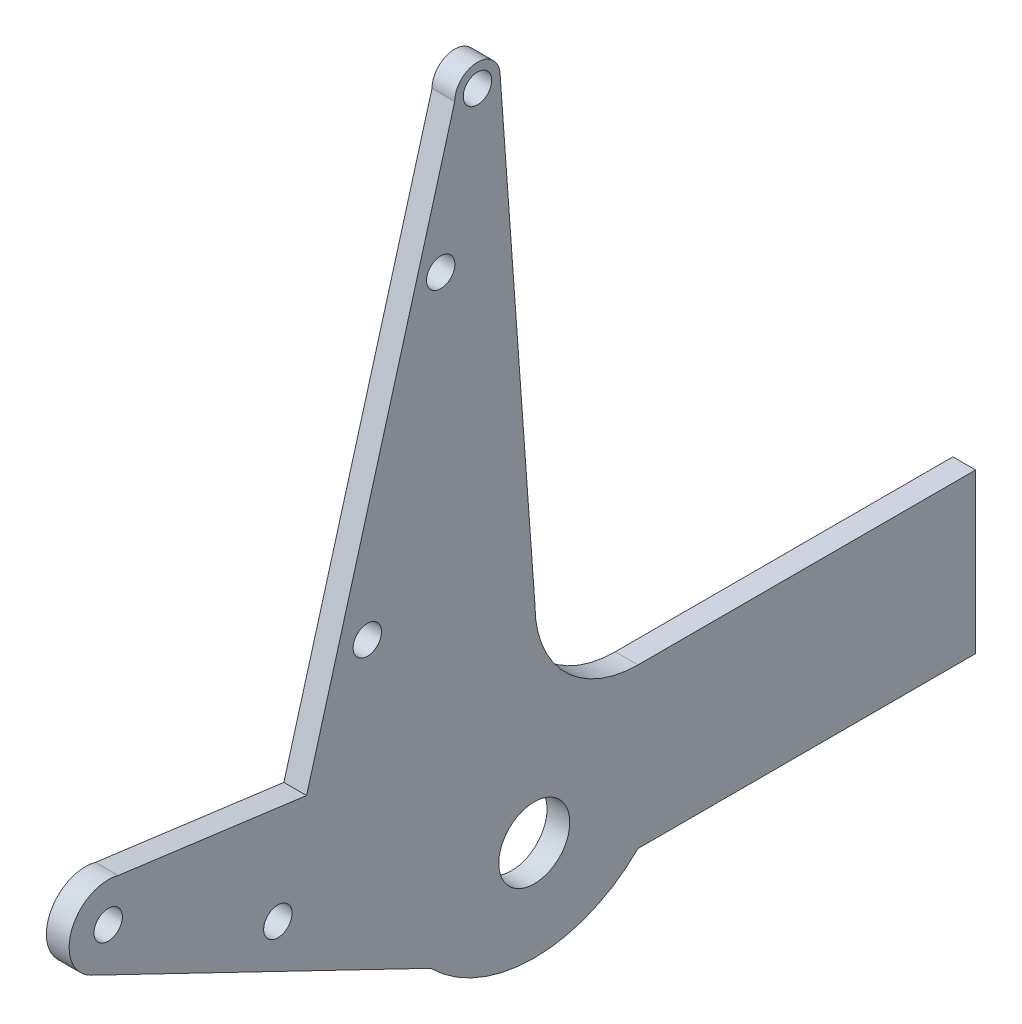
ISO-10303-21;
HEADER;
FILE_DESCRIPTION(('STEP AP214'),'2;1');
FILE_NAME('part.step','',(''),(''),'','','');
FILE_SCHEMA(('AUTOMOTIVE_DESIGN { 1 0 10303 214 1 1 1 1 }'));
ENDSEC;
DATA;
#1=APPLICATION_CONTEXT('core data for automotive mechanical design processes');
#2=APPLICATION_PROTOCOL_DEFINITION('international standard','automotive_design',2000,#1);
#3=PRODUCT_CONTEXT('',#1,'mechanical');
#4=PRODUCT('Part','Part','',(#3));
#5=PRODUCT_RELATED_PRODUCT_CATEGORY('part','',(#4));
#6=PRODUCT_DEFINITION_FORMATION('','',#4);
#7=PRODUCT_DEFINITION_CONTEXT('part definition',#1,'design');
#8=PRODUCT_DEFINITION('design','',#6,#7);
#9=PRODUCT_DEFINITION_SHAPE('','',#8);
#10=(LENGTH_UNIT() NAMED_UNIT(*) SI_UNIT(.MILLI.,.METRE.));
#11=(NAMED_UNIT(*) PLANE_ANGLE_UNIT() SI_UNIT($,.RADIAN.));
#12=(NAMED_UNIT(*) SI_UNIT($,.STERADIAN.) SOLID_ANGLE_UNIT());
#13=UNCERTAINTY_MEASURE_WITH_UNIT(LENGTH_MEASURE(1.E-05),#10,'distance_accuracy_value','');
#14=(GEOMETRIC_REPRESENTATION_CONTEXT(3) GLOBAL_UNCERTAINTY_ASSIGNED_CONTEXT((#13)) GLOBAL_UNIT_ASSIGNED_CONTEXT((#10,
#11,#12)) REPRESENTATION_CONTEXT('',''));
#15=CARTESIAN_POINT('',(0.,0.,0.));
#16=DIRECTION('',(0.,0.,1.));
#17=DIRECTION('',(1.,0.,0.));
#18=AXIS2_PLACEMENT_3D('',#15,#16,#17);
#19=CARTESIAN_POINT('',(4.,120.,85.75));
#20=DIRECTION('',(-1.,0.,0.));
#21=DIRECTION('',(0.,0.,1.));
#22=AXIS2_PLACEMENT_3D('',#19,#20,#21);
#23=CYLINDRICAL_SURFACE('',#22,2.5);
#24=CARTESIAN_POINT('',(4.,120.,85.75));
#25=DIRECTION('',(1.,0.,0.));
#26=DIRECTION('',(0.,0.,-1.));
#27=AXIS2_PLACEMENT_3D('',#24,#25,#26);
#28=CIRCLE('',#27,2.5);
#29=CARTESIAN_POINT('',(4.,120.,83.25));
#30=VERTEX_POINT('',#29);
#31=EDGE_CURVE('E242',#30,#30,#28,.T.);
#32=ORIENTED_EDGE('',*,*,#31,.T.);
#33=EDGE_LOOP('',(#32));
#34=FACE_BOUND('',#33,.T.);
#35=CARTESIAN_POINT('',(0.,120.,85.75));
#36=DIRECTION('',(1.,0.,0.));
#37=DIRECTION('',(0.,0.,-1.));
#38=AXIS2_PLACEMENT_3D('',#35,#36,#37);
#39=CIRCLE('',#38,2.5);
#40=CARTESIAN_POINT('',(0.,120.,83.25));
#41=VERTEX_POINT('',#40);
#42=EDGE_CURVE('E279',#41,#41,#39,.T.);
#43=ORIENTED_EDGE('',*,*,#42,.F.);
#44=EDGE_LOOP('',(#43));
#45=FACE_BOUND('',#44,.T.);
#46=ADVANCED_FACE('F112',(#34,#45),#23,.F.);
#47=CARTESIAN_POINT('',(4.,95.2087246019251,92.2130097639669));
#48=DIRECTION('',(-1.,0.,0.));
#49=DIRECTION('',(0.,0.,1.));
#50=AXIS2_PLACEMENT_3D('',#47,#48,#49);
#51=CYLINDRICAL_SURFACE('',#50,2.50000000000001);
#52=CARTESIAN_POINT('',(4.,95.2087246019251,92.2130097639669));
#53=DIRECTION('',(1.,0.,0.));
#54=DIRECTION('',(0.,0.,-1.));
#55=AXIS2_PLACEMENT_3D('',#52,#53,#54);
#56=CIRCLE('',#55,2.50000000000001);
#57=CARTESIAN_POINT('',(4.,95.2087246019251,89.7130097639669));
#58=VERTEX_POINT('',#57);
#59=EDGE_CURVE('E239',#58,#58,#56,.T.);
#60=ORIENTED_EDGE('',*,*,#59,.T.);
#61=EDGE_LOOP('',(#60));
#62=FACE_BOUND('',#61,.T.);
#63=CARTESIAN_POINT('',(0.,95.2087246019251,92.2130097639669));
#64=DIRECTION('',(1.,0.,0.));
#65=DIRECTION('',(0.,0.,-1.));
#66=AXIS2_PLACEMENT_3D('',#63,#64,#65);
#67=CIRCLE('',#66,2.50000000000001);
#68=CARTESIAN_POINT('',(0.,95.2087246019251,89.7130097639669));
#69=VERTEX_POINT('',#68);
#70=EDGE_CURVE('E276',#69,#69,#67,.T.);
#71=ORIENTED_EDGE('',*,*,#70,.F.);
#72=EDGE_LOOP('',(#71));
#73=FACE_BOUND('',#72,.T.);
#74=ADVANCED_FACE('F350',(#62,#73),#51,.F.);
#75=CARTESIAN_POINT('',(4.,45.6356022797336,105.136571317542));
#76=DIRECTION('',(-1.,0.,0.));
#77=DIRECTION('',(0.,0.,1.));
#78=AXIS2_PLACEMENT_3D('',#75,#76,#77);
#79=CYLINDRICAL_SURFACE('',#78,2.50000000000001);
#80=CARTESIAN_POINT('',(4.,45.6356022797336,105.136571317542));
#81=DIRECTION('',(1.,0.,0.));
#82=DIRECTION('',(0.,0.,-1.));
#83=AXIS2_PLACEMENT_3D('',#80,#81,#82);
#84=CIRCLE('',#83,2.50000000000001);
#85=CARTESIAN_POINT('',(4.,45.6356022797336,102.636571317542));
#86=VERTEX_POINT('',#85);
#87=EDGE_CURVE('E236',#86,#86,#84,.T.);
#88=ORIENTED_EDGE('',*,*,#87,.T.);
#89=EDGE_LOOP('',(#88));
#90=FACE_BOUND('',#89,.T.);
#91=CARTESIAN_POINT('',(0.,45.6356022797336,105.136571317542));
#92=DIRECTION('',(1.,0.,0.));
#93=DIRECTION('',(0.,0.,-1.));
#94=AXIS2_PLACEMENT_3D('',#91,#92,#93);
#95=CIRCLE('',#94,2.50000000000001);
#96=CARTESIAN_POINT('',(0.,45.6356022797336,102.636571317542));
#97=VERTEX_POINT('',#96);
#98=EDGE_CURVE('E273',#97,#97,#95,.T.);
#99=ORIENTED_EDGE('',*,*,#98,.F.);
#100=EDGE_LOOP('',(#99));
#101=FACE_BOUND('',#100,.T.);
#102=ADVANCED_FACE('F356',(#90,#101),#79,.F.);
#103=CARTESIAN_POINT('',(4.,10.6007738750233,120.879671398664));
#104=DIRECTION('',(-1.,0.,0.));
#105=DIRECTION('',(0.,0.,1.));
#106=AXIS2_PLACEMENT_3D('',#103,#104,#105);
#107=CYLINDRICAL_SURFACE('',#106,2.5);
#108=CARTESIAN_POINT('',(4.,10.6007738750233,120.879671398664));
#109=DIRECTION('',(1.,0.,0.));
#110=DIRECTION('',(0.,0.,-1.));
#111=AXIS2_PLACEMENT_3D('',#108,#109,#110);
#112=CIRCLE('',#111,2.5);
#113=CARTESIAN_POINT('',(4.,10.6007738750233,118.379671398664));
#114=VERTEX_POINT('',#113);
#115=EDGE_CURVE('E233',#114,#114,#112,.T.);
#116=ORIENTED_EDGE('',*,*,#115,.T.);
#117=EDGE_LOOP('',(#116));
#118=FACE_BOUND('',#117,.T.);
#119=CARTESIAN_POINT('',(0.,10.6007738750233,120.879671398664));
#120=DIRECTION('',(1.,0.,0.));
#121=DIRECTION('',(0.,0.,-1.));
#122=AXIS2_PLACEMENT_3D('',#119,#120,#121);
#123=CIRCLE('',#122,2.5);
#124=CARTESIAN_POINT('',(0.,10.6007738750233,118.379671398664));
#125=VERTEX_POINT('',#124);
#126=EDGE_CURVE('E270',#125,#125,#123,.T.);
#127=ORIENTED_EDGE('',*,*,#126,.F.);
#128=EDGE_LOOP('',(#127));
#129=FACE_BOUND('',#128,.T.);
#130=ADVANCED_FACE('F365',(#118,#129),#107,.F.);
#131=CARTESIAN_POINT('',(4.,120.,85.75));
#132=DIRECTION('',(-1.,0.,0.));
#133=DIRECTION('',(0.,0.,1.));
#134=AXIS2_PLACEMENT_3D('',#131,#132,#133);
#135=CYLINDRICAL_SURFACE('',#134,4.00000000000001);
#136=CARTESIAN_POINT('',(0.,120.,85.75));
#137=DIRECTION('',(1.,0.,0.));
#138=DIRECTION('',(0.,0.,-1.));
#139=AXIS2_PLACEMENT_3D('',#136,#137,#138);
#140=CIRCLE('',#139,4.00000000000001);
#141=CARTESIAN_POINT('',(0.,120.,81.75));
#142=VERTEX_POINT('',#141);
#143=CARTESIAN_POINT('',(0.,120.,89.75));
#144=VERTEX_POINT('',#143);
#145=EDGE_CURVE('E253',#142,#144,#140,.T.);
#146=ORIENTED_EDGE('',*,*,#145,.T.);
#147=DIRECTION('',(-1.,0.,0.));
#148=VECTOR('',#147,1.);
#149=CARTESIAN_POINT('',(4.,120.,89.75));
#150=LINE('',#149,#148);
#151=CARTESIAN_POINT('',(4.,120.,89.75));
#152=VERTEX_POINT('',#151);
#153=EDGE_CURVE('E122',#152,#144,#150,.T.);
#154=ORIENTED_EDGE('',*,*,#153,.F.);
#155=CARTESIAN_POINT('',(4.,120.,85.75));
#156=DIRECTION('',(1.,0.,0.));
#157=DIRECTION('',(0.,0.,-1.));
#158=AXIS2_PLACEMENT_3D('',#155,#156,#157);
#159=CIRCLE('',#158,4.00000000000001);
#160=CARTESIAN_POINT('',(4.,120.,81.75));
#161=VERTEX_POINT('',#160);
#162=EDGE_CURVE('E178',#161,#152,#159,.T.);
#163=ORIENTED_EDGE('',*,*,#162,.F.);
#164=DIRECTION('',(-1.,0.,0.));
#165=VECTOR('',#164,1.);
#166=CARTESIAN_POINT('',(4.,120.,81.75));
#167=LINE('',#166,#165);
#168=EDGE_CURVE('E12',#161,#142,#167,.T.);
#169=ORIENTED_EDGE('',*,*,#168,.T.);
#170=EDGE_LOOP('',(#146,#154,#163,#169));
#171=FACE_BOUND('',#170,.T.);
#172=ADVANCED_FACE('F368',(#171),#135,.T.);
#173=CARTESIAN_POINT('',(4.,32.1711600489639,114.440230481754));
#174=DIRECTION('',(0.,0.270627436163678,0.962684159418588));
#175=DIRECTION('',(0.,-0.962684159418588,0.270627436163678));
#176=AXIS2_PLACEMENT_3D('',#173,#174,#175);
#177=PLANE('',#176);
#178=DIRECTION('',(0.,0.962684159418588,-0.270627436163678));
#179=VECTOR('',#178,1.);
#180=CARTESIAN_POINT('',(0.,32.1711600489639,114.440230481754));
#181=LINE('',#180,#179);
#182=CARTESIAN_POINT('',(0.,27.2536423524357,115.822631130483));
#183=VERTEX_POINT('',#182);
#184=EDGE_CURVE('E256',#183,#144,#181,.T.);
#185=ORIENTED_EDGE('',*,*,#184,.F.);
#186=DIRECTION('',(-1.,0.,0.));
#187=VECTOR('',#186,1.);
#188=CARTESIAN_POINT('',(4.,27.2536423524357,115.822631130483));
#189=LINE('',#188,#187);
#190=CARTESIAN_POINT('',(4.,27.2536423524357,115.822631130483));
#191=VERTEX_POINT('',#190);
#192=EDGE_CURVE('E290',#191,#183,#189,.T.);
#193=ORIENTED_EDGE('',*,*,#192,.F.);
#194=DIRECTION('',(0.,0.962684159418588,-0.270627436163678));
#195=VECTOR('',#194,1.);
#196=CARTESIAN_POINT('',(4.,32.1711600489639,114.440230481754));
#197=LINE('',#196,#195);
#198=EDGE_CURVE('E313',#191,#152,#197,.T.);
#199=ORIENTED_EDGE('',*,*,#198,.T.);
#200=ORIENTED_EDGE('',*,*,#153,.T.);
#201=EDGE_LOOP('',(#185,#193,#199,#200));
#202=FACE_BOUND('',#201,.T.);
#203=ADVANCED_FACE('F373',(#202),#177,.T.);
#204=CARTESIAN_POINT('',(4.,11.7235188709124,-1.55117821193052));
#205=DIRECTION('',(0.,-0.991359868823639,0.131170158519295));
#206=DIRECTION('',(0.,-0.131170158519295,-0.991359868823639));
#207=AXIS2_PLACEMENT_3D('',#204,#205,#206);
#208=PLANE('',#207);
#209=DIRECTION('',(0.,0.131170158519295,0.991359868823639));
#210=VECTOR('',#209,1.);
#211=CARTESIAN_POINT('',(0.,11.7235188709124,-1.55117821193052));
#212=LINE('',#211,#210);
#213=CARTESIAN_POINT('',(0.,31.6384228558178,148.96199357178));
#214=VERTEX_POINT('',#213);
#215=EDGE_CURVE('E259',#183,#214,#212,.T.);
#216=ORIENTED_EDGE('',*,*,#215,.T.);
#217=DIRECTION('',(-1.,0.,0.));
#218=VECTOR('',#217,1.);
#219=CARTESIAN_POINT('',(4.,31.6384228558178,148.96199357178));
#220=LINE('',#219,#218);
#221=CARTESIAN_POINT('',(4.,31.6384228558178,148.96199357178));
#222=VERTEX_POINT('',#221);
#223=EDGE_CURVE('E288',#222,#214,#220,.T.);
#224=ORIENTED_EDGE('',*,*,#223,.F.);
#225=DIRECTION('',(0.,0.131170158519295,0.991359868823639));
#226=VECTOR('',#225,1.);
#227=CARTESIAN_POINT('',(4.,11.7235188709124,-1.55117821193052));
#228=LINE('',#227,#226);
#229=EDGE_CURVE('E312',#191,#222,#228,.T.);
#230=ORIENTED_EDGE('',*,*,#229,.F.);
#231=ORIENTED_EDGE('',*,*,#192,.T.);
#232=EDGE_LOOP('',(#216,#224,#230,#231));
#233=FACE_BOUND('',#232,.T.);
#234=ADVANCED_FACE('F532',(#233),#208,.F.);
#235=CARTESIAN_POINT('',(4.,-44.8910821768294,21.648440624659));
#236=DIRECTION('',(0.,-0.900733151785986,0.434372868942899));
#237=DIRECTION('',(0.,-0.434372868942899,-0.900733151785986));
#238=AXIS2_PLACEMENT_3D('',#235,#236,#237);
#239=PLANE('',#238);
#240=DIRECTION('',(0.,0.434372868942899,0.900733151785986));
#241=VECTOR('',#240,1.);
#242=CARTESIAN_POINT('',(0.,-44.8910821768294,21.648440624659));
#243=LINE('',#242,#241);
#244=CARTESIAN_POINT('',(0.,-10.,94.));
#245=VERTEX_POINT('',#244);
#246=CARTESIAN_POINT('',(0.,18.8074595814714,153.736313473982));
#247=VERTEX_POINT('',#246);
#248=EDGE_CURVE('E262',#245,#247,#243,.T.);
#249=ORIENTED_EDGE('',*,*,#248,.F.);
#250=DIRECTION('',(-1.,0.,0.));
#251=VECTOR('',#250,1.);
#252=CARTESIAN_POINT('',(4.,-10.,94.));
#253=LINE('',#252,#251);
#254=CARTESIAN_POINT('',(4.,-10.,94.));
#255=VERTEX_POINT('',#254);
#256=EDGE_CURVE('E208',#255,#245,#253,.T.);
#257=ORIENTED_EDGE('',*,*,#256,.F.);
#258=DIRECTION('',(0.,0.434372868942899,0.900733151785986));
#259=VECTOR('',#258,1.);
#260=CARTESIAN_POINT('',(4.,-44.8910821768294,21.648440624659));
#261=LINE('',#260,#259);
#262=CARTESIAN_POINT('',(4.,18.8074595814714,153.736313473982));
#263=VERTEX_POINT('',#262);
#264=EDGE_CURVE('E221',#255,#263,#261,.T.);
#265=ORIENTED_EDGE('',*,*,#264,.T.);
#266=DIRECTION('',(-1.,0.,0.));
#267=VECTOR('',#266,1.);
#268=CARTESIAN_POINT('',(4.,18.8074595814714,153.736313473982));
#269=LINE('',#268,#267);
#270=EDGE_CURVE('E286',#263,#247,#269,.T.);
#271=ORIENTED_EDGE('',*,*,#270,.T.);
#272=EDGE_LOOP('',(#249,#257,#265,#271));
#273=FACE_BOUND('',#272,.T.);
#274=ADVANCED_FACE('F311',(#273),#239,.T.);
#275=CARTESIAN_POINT('',(4.,8.25000000000002,75.75));
#276=DIRECTION('',(-1.,0.,0.));
#277=DIRECTION('',(0.,0.,1.));
#278=AXIS2_PLACEMENT_3D('',#275,#276,#277);
#279=CYLINDRICAL_SURFACE('',#278,25.809397513309);
#280=CARTESIAN_POINT('',(0.,8.25000000000002,75.75));
#281=DIRECTION('',(1.,0.,0.));
#282=DIRECTION('',(0.,0.,-1.));
#283=AXIS2_PLACEMENT_3D('',#280,#281,#282);
#284=CIRCLE('',#283,25.809397513309);
#285=CARTESIAN_POINT('',(0.,-9.99999999999999,57.5));
#286=VERTEX_POINT('',#285);
#287=EDGE_CURVE('E203',#286,#245,#284,.F.);
#288=ORIENTED_EDGE('',*,*,#287,.F.);
#289=DIRECTION('',(-1.,0.,0.));
#290=VECTOR('',#289,1.);
#291=CARTESIAN_POINT('',(4.,-9.99999999999999,57.5));
#292=LINE('',#291,#290);
#293=CARTESIAN_POINT('',(4.,-9.99999999999999,57.5));
#294=VERTEX_POINT('',#293);
#295=EDGE_CURVE('E198',#294,#286,#292,.T.);
#296=ORIENTED_EDGE('',*,*,#295,.F.);
#297=CARTESIAN_POINT('',(4.,8.25000000000002,75.75));
#298=DIRECTION('',(1.,0.,0.));
#299=DIRECTION('',(0.,0.,-1.));
#300=AXIS2_PLACEMENT_3D('',#297,#298,#299);
#301=CIRCLE('',#300,25.809397513309);
#302=EDGE_CURVE('E201',#294,#255,#301,.F.);
#303=ORIENTED_EDGE('',*,*,#302,.T.);
#304=ORIENTED_EDGE('',*,*,#256,.T.);
#305=EDGE_LOOP('',(#288,#296,#303,#304));
#306=FACE_BOUND('',#305,.T.);
#307=ADVANCED_FACE('F200',(#306),#279,.T.);
#308=CARTESIAN_POINT('',(4.,-9.99999999999995,0.));
#309=DIRECTION('',(0.,-1.,0.));
#310=DIRECTION('',(0.,0.,-1.));
#311=AXIS2_PLACEMENT_3D('',#308,#309,#310);
#312=PLANE('',#311);
#313=DIRECTION('',(0.,0.,1.));
#314=VECTOR('',#313,1.);
#315=CARTESIAN_POINT('',(0.,-9.99999999999995,0.));
#316=LINE('',#315,#314);
#317=CARTESIAN_POINT('',(0.,-10.,-1.94));
#318=VERTEX_POINT('',#317);
#319=EDGE_CURVE('E266',#318,#286,#316,.T.);
#320=ORIENTED_EDGE('',*,*,#319,.F.);
#321=DIRECTION('',(-1.,0.,0.));
#322=VECTOR('',#321,1.);
#323=CARTESIAN_POINT('',(4.,-10.,-1.94));
#324=LINE('',#323,#322);
#325=CARTESIAN_POINT('',(4.,-10.,-1.94));
#326=VERTEX_POINT('',#325);
#327=EDGE_CURVE('E225',#326,#318,#324,.T.);
#328=ORIENTED_EDGE('',*,*,#327,.F.);
#329=DIRECTION('',(0.,0.,1.));
#330=VECTOR('',#329,1.);
#331=CARTESIAN_POINT('',(4.,-9.99999999999995,0.));
#332=LINE('',#331,#330);
#333=EDGE_CURVE('E217',#326,#294,#332,.T.);
#334=ORIENTED_EDGE('',*,*,#333,.T.);
#335=ORIENTED_EDGE('',*,*,#295,.T.);
#336=EDGE_LOOP('',(#320,#328,#334,#335));
#337=FACE_BOUND('',#336,.T.);
#338=ADVANCED_FACE('F223',(#337),#312,.T.);
#339=CARTESIAN_POINT('',(4.,18.,0.));
#340=DIRECTION('',(0.,-1.,0.));
#341=DIRECTION('',(0.,0.,-1.));
#342=AXIS2_PLACEMENT_3D('',#339,#340,#341);
#343=PLANE('',#342);
#344=DIRECTION('',(0.,0.,1.));
#345=VECTOR('',#344,1.);
#346=CARTESIAN_POINT('',(0.,18.,0.));
#347=LINE('',#346,#345);
#348=CARTESIAN_POINT('',(0.,18.,-1.94));
#349=VERTEX_POINT('',#348);
#350=CARTESIAN_POINT('',(0.,18.,57.5));
#351=VERTEX_POINT('',#350);
#352=EDGE_CURVE('E164',#349,#351,#347,.T.);
#353=ORIENTED_EDGE('',*,*,#352,.T.);
#354=DIRECTION('',(-1.,0.,0.));
#355=VECTOR('',#354,1.);
#356=CARTESIAN_POINT('',(4.,18.,57.5));
#357=LINE('',#356,#355);
#358=CARTESIAN_POINT('',(4.,18.,57.5));
#359=VERTEX_POINT('',#358);
#360=EDGE_CURVE('E209',#359,#351,#357,.T.);
#361=ORIENTED_EDGE('',*,*,#360,.F.);
#362=DIRECTION('',(0.,0.,1.));
#363=VECTOR('',#362,1.);
#364=CARTESIAN_POINT('',(4.,18.,0.));
#365=LINE('',#364,#363);
#366=CARTESIAN_POINT('',(4.,18.,-1.94));
#367=VERTEX_POINT('',#366);
#368=EDGE_CURVE('E227',#367,#359,#365,.T.);
#369=ORIENTED_EDGE('',*,*,#368,.F.);
#370=DIRECTION('',(1.,0.,0.));
#371=VECTOR('',#370,1.);
#372=CARTESIAN_POINT('',(4.,18.,-1.94));
#373=LINE('',#372,#371);
#374=EDGE_CURVE('E298',#349,#367,#373,.T.);
#375=ORIENTED_EDGE('',*,*,#374,.F.);
#376=EDGE_LOOP('',(#353,#361,#369,#375));
#377=FACE_BOUND('',#376,.T.);
#378=ADVANCED_FACE('F338',(#377),#343,.F.);
#379=CARTESIAN_POINT('',(4.,36.1254310293576,57.5));
#380=DIRECTION('',(-1.,0.,0.));
#381=DIRECTION('',(0.,0.,1.));
#382=AXIS2_PLACEMENT_3D('',#379,#380,#381);
#383=CYLINDRICAL_SURFACE('',#382,18.1254310293576);
#384=CARTESIAN_POINT('',(0.,36.1254310293576,57.5));
#385=DIRECTION('',(1.,0.,0.));
#386=DIRECTION('',(0.,0.,-1.));
#387=AXIS2_PLACEMENT_3D('',#384,#385,#386);
#388=CIRCLE('',#387,18.1254310293576);
#389=CARTESIAN_POINT('',(0.,36.1878774290049,75.6253234577254));
#390=VERTEX_POINT('',#389);
#391=EDGE_CURVE('E170',#351,#390,#388,.F.);
#392=ORIENTED_EDGE('',*,*,#391,.T.);
#393=DIRECTION('',(-1.,0.,0.));
#394=VECTOR('',#393,1.);
#395=CARTESIAN_POINT('',(4.,36.1878774290049,75.6253234577254));
#396=LINE('',#395,#394);
#397=CARTESIAN_POINT('',(4.,36.1878774290049,75.6253234577254));
#398=VERTEX_POINT('',#397);
#399=EDGE_CURVE('E245',#398,#390,#396,.T.);
#400=ORIENTED_EDGE('',*,*,#399,.F.);
#401=CARTESIAN_POINT('',(4.,36.1254310293576,57.5));
#402=DIRECTION('',(1.,0.,0.));
#403=DIRECTION('',(0.,0.,-1.));
#404=AXIS2_PLACEMENT_3D('',#401,#402,#403);
#405=CIRCLE('',#404,18.1254310293576);
#406=EDGE_CURVE('E131',#359,#398,#405,.F.);
#407=ORIENTED_EDGE('',*,*,#406,.F.);
#408=ORIENTED_EDGE('',*,*,#360,.T.);
#409=EDGE_LOOP('',(#392,#400,#407,#408));
#410=FACE_BOUND('',#409,.T.);
#411=ADVANCED_FACE('F340',(#410),#383,.F.);
#412=CARTESIAN_POINT('',(4.,-5.30483896254168,72.5931908859332));
#413=DIRECTION('',(0.,-0.0728819202601994,0.997340576583138));
#414=DIRECTION('',(0.,-0.997340576583138,-0.0728819202601994));
#415=AXIS2_PLACEMENT_3D('',#412,#413,#414);
#416=PLANE('',#415);
#417=DIRECTION('',(0.,0.997340576583138,0.0728819202601994));
#418=VECTOR('',#417,1.);
#419=CARTESIAN_POINT('',(0.,-5.30483896254168,72.5931908859332));
#420=LINE('',#419,#418);
#421=EDGE_CURVE('E249',#390,#142,#420,.T.);
#422=ORIENTED_EDGE('',*,*,#421,.T.);
#423=ORIENTED_EDGE('',*,*,#168,.F.);
#424=DIRECTION('',(0.,0.997340576583138,0.0728819202601994));
#425=VECTOR('',#424,1.);
#426=CARTESIAN_POINT('',(4.,-5.30483896254168,72.5931908859332));
#427=LINE('',#426,#425);
#428=EDGE_CURVE('E319',#398,#161,#427,.T.);
#429=ORIENTED_EDGE('',*,*,#428,.F.);
#430=ORIENTED_EDGE('',*,*,#399,.T.);
#431=EDGE_LOOP('',(#422,#423,#429,#430));
#432=FACE_BOUND('',#431,.T.);
#433=ADVANCED_FACE('F346',(#432),#416,.F.);
#434=CARTESIAN_POINT('',(4.,0.,75.75));
#435=DIRECTION('',(-1.,0.,0.));
#436=DIRECTION('',(0.,0.,1.));
#437=AXIS2_PLACEMENT_3D('',#434,#435,#436);
#438=CYLINDRICAL_SURFACE('',#437,6.25);
#439=CARTESIAN_POINT('',(4.,0.,75.75));
#440=DIRECTION('',(1.,0.,0.));
#441=DIRECTION('',(0.,0.,-1.));
#442=AXIS2_PLACEMENT_3D('',#439,#440,#441);
#443=CIRCLE('',#442,6.25);
#444=CARTESIAN_POINT('',(4.,0.,69.5));
#445=VERTEX_POINT('',#444);
#446=EDGE_CURVE('E282',#445,#445,#443,.T.);
#447=ORIENTED_EDGE('',*,*,#446,.T.);
#448=EDGE_LOOP('',(#447));
#449=FACE_BOUND('',#448,.T.);
#450=CARTESIAN_POINT('',(0.,0.,75.75));
#451=DIRECTION('',(1.,0.,0.));
#452=DIRECTION('',(0.,0.,-1.));
#453=AXIS2_PLACEMENT_3D('',#450,#451,#452);
#454=CIRCLE('',#453,6.25);
#455=CARTESIAN_POINT('',(0.,0.,69.5));
#456=VERTEX_POINT('',#455);
#457=EDGE_CURVE('E246',#456,#456,#454,.T.);
#458=ORIENTED_EDGE('',*,*,#457,.F.);
#459=EDGE_LOOP('',(#458));
#460=FACE_BOUND('',#459,.T.);
#461=ADVANCED_FACE('F380',(#449,#460),#438,.F.);
#462=CARTESIAN_POINT('',(0.,0.,0.));
#463=DIRECTION('',(1.,0.,0.));
#464=DIRECTION('',(0.,0.,-1.));
#465=AXIS2_PLACEMENT_3D('',#462,#463,#464);
#466=PLANE('',#465);
#467=ORIENTED_EDGE('',*,*,#457,.T.);
#468=EDGE_LOOP('',(#467));
#469=FACE_BOUND('',#468,.T.);
#470=ORIENTED_EDGE('',*,*,#421,.F.);
#471=ORIENTED_EDGE('',*,*,#391,.F.);
#472=ORIENTED_EDGE('',*,*,#352,.F.);
#473=DIRECTION('',(0.,1.,0.));
#474=VECTOR('',#473,1.);
#475=CARTESIAN_POINT('',(0.,18.,-1.94));
#476=LINE('',#475,#474);
#477=EDGE_CURVE('E325',#318,#349,#476,.T.);
#478=ORIENTED_EDGE('',*,*,#477,.F.);
#479=ORIENTED_EDGE('',*,*,#319,.T.);
#480=ORIENTED_EDGE('',*,*,#287,.T.);
#481=ORIENTED_EDGE('',*,*,#248,.T.);
#482=CARTESIAN_POINT('',(0.,25.,150.75));
#483=DIRECTION('',(1.,0.,0.));
#484=DIRECTION('',(0.,0.,-1.));
#485=AXIS2_PLACEMENT_3D('',#482,#483,#484);
#486=CIRCLE('',#485,6.87499999999998);
#487=EDGE_CURVE('E116',#214,#247,#486,.T.);
#488=ORIENTED_EDGE('',*,*,#487,.F.);
#489=ORIENTED_EDGE('',*,*,#215,.F.);
#490=ORIENTED_EDGE('',*,*,#184,.T.);
#491=ORIENTED_EDGE('',*,*,#145,.F.);
#492=EDGE_LOOP('',(#470,#471,#472,#478,#479,#480,#481,#488,#489,#490,#491));
#493=FACE_BOUND('',#492,.T.);
#494=ORIENTED_EDGE('',*,*,#126,.T.);
#495=EDGE_LOOP('',(#494));
#496=FACE_BOUND('',#495,.T.);
#497=ORIENTED_EDGE('',*,*,#98,.T.);
#498=EDGE_LOOP('',(#497));
#499=FACE_BOUND('',#498,.T.);
#500=ORIENTED_EDGE('',*,*,#70,.T.);
#501=EDGE_LOOP('',(#500));
#502=FACE_BOUND('',#501,.T.);
#503=ORIENTED_EDGE('',*,*,#42,.T.);
#504=EDGE_LOOP('',(#503));
#505=FACE_BOUND('',#504,.T.);
#506=CARTESIAN_POINT('',(0.,25.,150.75));
#507=DIRECTION('',(1.,0.,0.));
#508=DIRECTION('',(0.,0.,-1.));
#509=AXIS2_PLACEMENT_3D('',#506,#507,#508);
#510=CIRCLE('',#509,2.5);
#511=CARTESIAN_POINT('',(0.,25.,148.25));
#512=VERTEX_POINT('',#511);
#513=EDGE_CURVE('E296',#512,#512,#510,.T.);
#514=ORIENTED_EDGE('',*,*,#513,.T.);
#515=EDGE_LOOP('',(#514));
#516=FACE_BOUND('',#515,.T.);
#517=ADVANCED_FACE('F308',(#469,#493,#496,#499,#502,#505,#516),#466,.F.);
#518=CARTESIAN_POINT('',(4.,0.,0.));
#519=DIRECTION('',(1.,0.,0.));
#520=DIRECTION('',(0.,0.,-1.));
#521=AXIS2_PLACEMENT_3D('',#518,#519,#520);
#522=PLANE('',#521);
#523=ORIENTED_EDGE('',*,*,#446,.F.);
#524=EDGE_LOOP('',(#523));
#525=FACE_BOUND('',#524,.T.);
#526=ORIENTED_EDGE('',*,*,#428,.T.);
#527=ORIENTED_EDGE('',*,*,#162,.T.);
#528=ORIENTED_EDGE('',*,*,#198,.F.);
#529=ORIENTED_EDGE('',*,*,#229,.T.);
#530=CARTESIAN_POINT('',(4.,25.,150.75));
#531=DIRECTION('',(1.,0.,0.));
#532=DIRECTION('',(0.,0.,-1.));
#533=AXIS2_PLACEMENT_3D('',#530,#531,#532);
#534=CIRCLE('',#533,6.87499999999998);
#535=EDGE_CURVE('E250',#222,#263,#534,.T.);
#536=ORIENTED_EDGE('',*,*,#535,.T.);
#537=ORIENTED_EDGE('',*,*,#264,.F.);
#538=ORIENTED_EDGE('',*,*,#302,.F.);
#539=ORIENTED_EDGE('',*,*,#333,.F.);
#540=DIRECTION('',(0.,-1.,0.));
#541=VECTOR('',#540,1.);
#542=CARTESIAN_POINT('',(4.,18.,-1.94));
#543=LINE('',#542,#541);
#544=EDGE_CURVE('E329',#367,#326,#543,.T.);
#545=ORIENTED_EDGE('',*,*,#544,.F.);
#546=ORIENTED_EDGE('',*,*,#368,.T.);
#547=ORIENTED_EDGE('',*,*,#406,.T.);
#548=EDGE_LOOP('',(#526,#527,#528,#529,#536,#537,#538,#539,#545,#546,#547));
#549=FACE_BOUND('',#548,.T.);
#550=ORIENTED_EDGE('',*,*,#115,.F.);
#551=EDGE_LOOP('',(#550));
#552=FACE_BOUND('',#551,.T.);
#553=ORIENTED_EDGE('',*,*,#87,.F.);
#554=EDGE_LOOP('',(#553));
#555=FACE_BOUND('',#554,.T.);
#556=ORIENTED_EDGE('',*,*,#59,.F.);
#557=EDGE_LOOP('',(#556));
#558=FACE_BOUND('',#557,.T.);
#559=ORIENTED_EDGE('',*,*,#31,.F.);
#560=EDGE_LOOP('',(#559));
#561=FACE_BOUND('',#560,.T.);
#562=CARTESIAN_POINT('',(4.,25.,150.75));
#563=DIRECTION('',(1.,0.,0.));
#564=DIRECTION('',(0.,0.,-1.));
#565=AXIS2_PLACEMENT_3D('',#562,#563,#564);
#566=CIRCLE('',#565,2.5);
#567=CARTESIAN_POINT('',(4.,25.,148.25));
#568=VERTEX_POINT('',#567);
#569=EDGE_CURVE('E293',#568,#568,#566,.T.);
#570=ORIENTED_EDGE('',*,*,#569,.F.);
#571=EDGE_LOOP('',(#570));
#572=FACE_BOUND('',#571,.T.);
#573=ADVANCED_FACE('F213',(#525,#549,#552,#555,#558,#561,#572),#522,.T.);
#574=CARTESIAN_POINT('',(4.,25.,150.75));
#575=DIRECTION('',(-1.,0.,0.));
#576=DIRECTION('',(0.,0.,1.));
#577=AXIS2_PLACEMENT_3D('',#574,#575,#576);
#578=CYLINDRICAL_SURFACE('',#577,2.5);
#579=ORIENTED_EDGE('',*,*,#569,.T.);
#580=EDGE_LOOP('',(#579));
#581=FACE_BOUND('',#580,.T.);
#582=ORIENTED_EDGE('',*,*,#513,.F.);
#583=EDGE_LOOP('',(#582));
#584=FACE_BOUND('',#583,.T.);
#585=ADVANCED_FACE('F390',(#581,#584),#578,.F.);
#586=CARTESIAN_POINT('',(4.,25.,150.75));
#587=DIRECTION('',(-1.,0.,0.));
#588=DIRECTION('',(0.,0.,1.));
#589=AXIS2_PLACEMENT_3D('',#586,#587,#588);
#590=CYLINDRICAL_SURFACE('',#589,6.87499999999998);
#591=ORIENTED_EDGE('',*,*,#535,.F.);
#592=ORIENTED_EDGE('',*,*,#223,.T.);
#593=ORIENTED_EDGE('',*,*,#487,.T.);
#594=ORIENTED_EDGE('',*,*,#270,.F.);
#595=EDGE_LOOP('',(#591,#592,#593,#594));
#596=FACE_BOUND('',#595,.T.);
#597=ADVANCED_FACE('F114',(#596),#590,.T.);
#598=CARTESIAN_POINT('',(0.,0.,-1.94));
#599=DIRECTION('',(0.,0.,-1.));
#600=DIRECTION('',(0.,1.,0.));
#601=AXIS2_PLACEMENT_3D('',#598,#599,#600);
#602=PLANE('',#601);
#603=ORIENTED_EDGE('',*,*,#544,.T.);
#604=ORIENTED_EDGE('',*,*,#327,.T.);
#605=ORIENTED_EDGE('',*,*,#477,.T.);
#606=ORIENTED_EDGE('',*,*,#374,.T.);
#607=EDGE_LOOP('',(#603,#604,#605,#606));
#608=FACE_BOUND('',#607,.T.);
#609=ADVANCED_FACE('F331',(#608),#602,.T.);
#610=CLOSED_SHELL('',(#46,#74,#102,#130,#172,#203,#234,#274,#307,#338,#378,#411,#433,#461,#517,
#573,#585,#597,#609));
#611=MANIFOLD_SOLID_BREP('B2',#610);
#612=ADVANCED_BREP_SHAPE_REPRESENTATION('',(#18,#611),#14);
#613=SHAPE_DEFINITION_REPRESENTATION(#9,#612);
ENDSEC;
END-ISO-10303-21;
